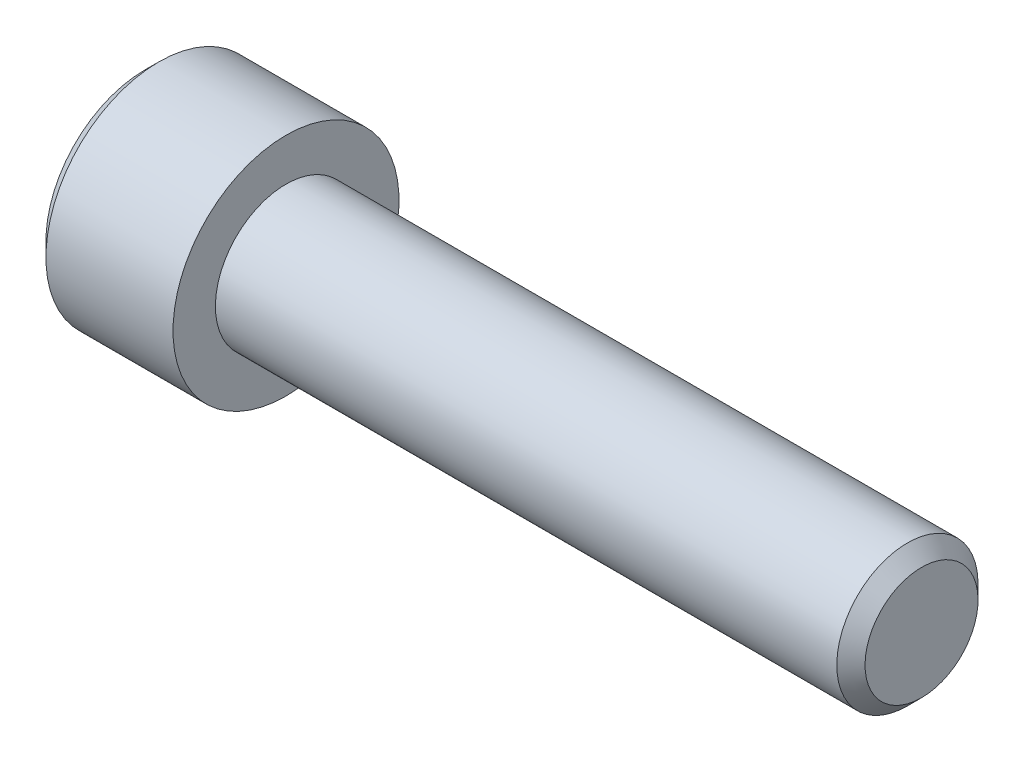
ISO-10303-21;
HEADER;
FILE_DESCRIPTION(('STEP AP214'),'2;1');
FILE_NAME('part.step','',(''),(''),'','','');
FILE_SCHEMA(('AUTOMOTIVE_DESIGN { 1 0 10303 214 1 1 1 1 }'));
ENDSEC;
DATA;
#1=APPLICATION_CONTEXT('core data for automotive mechanical design processes');
#2=APPLICATION_PROTOCOL_DEFINITION('international standard','automotive_design',2000,#1);
#3=PRODUCT_CONTEXT('',#1,'mechanical');
#4=PRODUCT('Part','Part','',(#3));
#5=PRODUCT_RELATED_PRODUCT_CATEGORY('part','',(#4));
#6=PRODUCT_DEFINITION_FORMATION('','',#4);
#7=PRODUCT_DEFINITION_CONTEXT('part definition',#1,'design');
#8=PRODUCT_DEFINITION('design','',#6,#7);
#9=PRODUCT_DEFINITION_SHAPE('','',#8);
#10=(LENGTH_UNIT() NAMED_UNIT(*) SI_UNIT(.MILLI.,.METRE.));
#11=(NAMED_UNIT(*) PLANE_ANGLE_UNIT() SI_UNIT($,.RADIAN.));
#12=(NAMED_UNIT(*) SI_UNIT($,.STERADIAN.) SOLID_ANGLE_UNIT());
#13=UNCERTAINTY_MEASURE_WITH_UNIT(LENGTH_MEASURE(1.E-05),#10,'distance_accuracy_value','');
#14=(GEOMETRIC_REPRESENTATION_CONTEXT(3) GLOBAL_UNCERTAINTY_ASSIGNED_CONTEXT((#13)) GLOBAL_UNIT_ASSIGNED_CONTEXT((#10,
#11,#12)) REPRESENTATION_CONTEXT('',''));
#15=CARTESIAN_POINT('',(0.,0.,0.));
#16=DIRECTION('',(0.,0.,1.));
#17=DIRECTION('',(1.,0.,0.));
#18=AXIS2_PLACEMENT_3D('',#15,#16,#17);
#19=CARTESIAN_POINT('',(-10.,0.,0.));
#20=DIRECTION('',(1.,0.,0.));
#21=DIRECTION('',(0.,1.,0.));
#22=AXIS2_PLACEMENT_3D('',#19,#20,#21);
#23=PLANE('',#22);
#24=CARTESIAN_POINT('',(-10.,0.,0.));
#25=DIRECTION('',(1.,0.,0.));
#26=DIRECTION('',(0.,1.,0.));
#27=AXIS2_PLACEMENT_3D('',#24,#25,#26);
#28=CIRCLE('',#27,7.);
#29=CARTESIAN_POINT('',(-10.,7.,0.));
#30=VERTEX_POINT('',#29);
#31=EDGE_CURVE('E42',#30,#30,#28,.F.);
#32=ORIENTED_EDGE('',*,*,#31,.T.);
#33=EDGE_LOOP('',(#32));
#34=FACE_BOUND('',#33,.T.);
#35=DIRECTION('',(0.,0.5,0.866025403784439));
#36=VECTOR('',#35,1.);
#37=CARTESIAN_POINT('',(-10.,2.30940107675851,-4.));
#38=LINE('',#37,#36);
#39=CARTESIAN_POINT('',(-10.,2.30940107675851,-4.));
#40=VERTEX_POINT('',#39);
#41=CARTESIAN_POINT('',(-10.,4.61880215351701,0.));
#42=VERTEX_POINT('',#41);
#43=EDGE_CURVE('E49',#40,#42,#38,.T.);
#44=ORIENTED_EDGE('',*,*,#43,.T.);
#45=DIRECTION('',(0.,-0.5,0.866025403784438));
#46=VECTOR('',#45,1.);
#47=CARTESIAN_POINT('',(-10.,4.61880215351701,0.));
#48=LINE('',#47,#46);
#49=CARTESIAN_POINT('',(-10.,2.3094010767585,4.));
#50=VERTEX_POINT('',#49);
#51=EDGE_CURVE('E107',#42,#50,#48,.T.);
#52=ORIENTED_EDGE('',*,*,#51,.T.);
#53=DIRECTION('',(0.,-1.,0.));
#54=VECTOR('',#53,1.);
#55=CARTESIAN_POINT('',(-10.,2.3094010767585,4.));
#56=LINE('',#55,#54);
#57=CARTESIAN_POINT('',(-10.,-2.3094010767585,4.));
#58=VERTEX_POINT('',#57);
#59=EDGE_CURVE('E291',#50,#58,#56,.T.);
#60=ORIENTED_EDGE('',*,*,#59,.T.);
#61=DIRECTION('',(0.,-0.5,-0.866025403784439));
#62=VECTOR('',#61,1.);
#63=CARTESIAN_POINT('',(-10.,-2.3094010767585,4.));
#64=LINE('',#63,#62);
#65=CARTESIAN_POINT('',(-10.,-4.61880215351701,0.));
#66=VERTEX_POINT('',#65);
#67=EDGE_CURVE('E288',#58,#66,#64,.T.);
#68=ORIENTED_EDGE('',*,*,#67,.T.);
#69=DIRECTION('',(0.,0.5,-0.866025403784439));
#70=VECTOR('',#69,1.);
#71=CARTESIAN_POINT('',(-10.,-4.61880215351701,0.));
#72=LINE('',#71,#70);
#73=CARTESIAN_POINT('',(-10.,-2.3094010767585,-4.));
#74=VERTEX_POINT('',#73);
#75=EDGE_CURVE('E282',#66,#74,#72,.T.);
#76=ORIENTED_EDGE('',*,*,#75,.T.);
#77=DIRECTION('',(0.,1.,0.));
#78=VECTOR('',#77,1.);
#79=CARTESIAN_POINT('',(-10.,-2.3094010767585,-4.));
#80=LINE('',#79,#78);
#81=EDGE_CURVE('E103',#74,#40,#80,.T.);
#82=ORIENTED_EDGE('',*,*,#81,.T.);
#83=EDGE_LOOP('',(#44,#52,#60,#68,#76,#82));
#84=FACE_BOUND('',#83,.T.);
#85=ADVANCED_FACE('F34',(#34,#84),#23,.F.);
#86=CARTESIAN_POINT('',(45.,0.,0.));
#87=DIRECTION('',(-1.,0.,0.));
#88=DIRECTION('',(0.,-1.,0.));
#89=AXIS2_PLACEMENT_3D('',#86,#87,#88);
#90=CYLINDRICAL_SURFACE('',#89,8.);
#91=CARTESIAN_POINT('',(-9.,0.,0.));
#92=DIRECTION('',(1.,0.,0.));
#93=DIRECTION('',(0.,1.,0.));
#94=AXIS2_PLACEMENT_3D('',#91,#92,#93);
#95=CIRCLE('',#94,8.);
#96=CARTESIAN_POINT('',(-9.,7.99999999999999,0.));
#97=VERTEX_POINT('',#96);
#98=EDGE_CURVE('E11',#97,#97,#95,.T.);
#99=ORIENTED_EDGE('',*,*,#98,.T.);
#100=EDGE_LOOP('',(#99));
#101=FACE_BOUND('',#100,.T.);
#102=CARTESIAN_POINT('',(0.,0.,0.));
#103=DIRECTION('',(-1.,0.,0.));
#104=DIRECTION('',(0.,-1.,0.));
#105=AXIS2_PLACEMENT_3D('',#102,#103,#104);
#106=CIRCLE('',#105,8.);
#107=CARTESIAN_POINT('',(0.,-8.,0.));
#108=VERTEX_POINT('',#107);
#109=EDGE_CURVE('E120',#108,#108,#106,.T.);
#110=ORIENTED_EDGE('',*,*,#109,.T.);
#111=EDGE_LOOP('',(#110));
#112=FACE_BOUND('',#111,.T.);
#113=ADVANCED_FACE('F143',(#101,#112),#90,.T.);
#114=CARTESIAN_POINT('',(0.,7.99999999999999,0.));
#115=DIRECTION('',(-1.,0.,0.));
#116=DIRECTION('',(0.,-1.,0.));
#117=AXIS2_PLACEMENT_3D('',#114,#115,#116);
#118=PLANE('',#117);
#119=ORIENTED_EDGE('',*,*,#109,.F.);
#120=EDGE_LOOP('',(#119));
#121=FACE_BOUND('',#120,.T.);
#122=CARTESIAN_POINT('',(0.,0.,0.));
#123=DIRECTION('',(-1.,0.,0.));
#124=DIRECTION('',(0.,-1.,0.));
#125=AXIS2_PLACEMENT_3D('',#122,#123,#124);
#126=CIRCLE('',#125,5.);
#127=CARTESIAN_POINT('',(0.,-5.,0.));
#128=VERTEX_POINT('',#127);
#129=EDGE_CURVE('E112',#128,#128,#126,.T.);
#130=ORIENTED_EDGE('',*,*,#129,.T.);
#131=EDGE_LOOP('',(#130));
#132=FACE_BOUND('',#131,.T.);
#133=ADVANCED_FACE('F148',(#121,#132),#118,.F.);
#134=CARTESIAN_POINT('',(45.,0.,0.));
#135=DIRECTION('',(-1.,0.,0.));
#136=DIRECTION('',(0.,-1.,0.));
#137=AXIS2_PLACEMENT_3D('',#134,#135,#136);
#138=CYLINDRICAL_SURFACE('',#137,5.);
#139=CARTESIAN_POINT('',(44.,0.,0.));
#140=DIRECTION('',(-1.,0.,0.));
#141=DIRECTION('',(0.,-1.,0.));
#142=AXIS2_PLACEMENT_3D('',#139,#140,#141);
#143=CIRCLE('',#142,5.);
#144=CARTESIAN_POINT('',(44.,-5.,0.));
#145=VERTEX_POINT('',#144);
#146=EDGE_CURVE('E123',#145,#145,#143,.T.);
#147=ORIENTED_EDGE('',*,*,#146,.T.);
#148=EDGE_LOOP('',(#147));
#149=FACE_BOUND('',#148,.T.);
#150=ORIENTED_EDGE('',*,*,#129,.F.);
#151=EDGE_LOOP('',(#150));
#152=FACE_BOUND('',#151,.T.);
#153=ADVANCED_FACE('F154',(#149,#152),#138,.T.);
#154=CARTESIAN_POINT('',(45.,4.99999999999999,0.));
#155=DIRECTION('',(-1.,0.,0.));
#156=DIRECTION('',(0.,-1.,0.));
#157=AXIS2_PLACEMENT_3D('',#154,#155,#156);
#158=PLANE('',#157);
#159=CARTESIAN_POINT('',(45.,0.,0.));
#160=DIRECTION('',(-1.,0.,0.));
#161=DIRECTION('',(0.,-1.,0.));
#162=AXIS2_PLACEMENT_3D('',#159,#160,#161);
#163=CIRCLE('',#162,3.99999999999998);
#164=CARTESIAN_POINT('',(45.,-3.99999999999999,0.));
#165=VERTEX_POINT('',#164);
#166=EDGE_CURVE('E126',#165,#165,#163,.F.);
#167=ORIENTED_EDGE('',*,*,#166,.T.);
#168=EDGE_LOOP('',(#167));
#169=FACE_BOUND('',#168,.T.);
#170=ADVANCED_FACE('F158',(#169),#158,.F.);
#171=CARTESIAN_POINT('',(-5.,2.30940107675851,-4.));
#172=DIRECTION('',(0.,-0.866025403784439,0.5));
#173=DIRECTION('',(0.,-0.5,-0.866025403784439));
#174=AXIS2_PLACEMENT_3D('',#171,#172,#173);
#175=PLANE('',#174);
#176=ORIENTED_EDGE('',*,*,#43,.F.);
#177=DIRECTION('',(-1.,0.,0.));
#178=VECTOR('',#177,1.);
#179=CARTESIAN_POINT('',(-5.,2.30940107675851,-4.));
#180=LINE('',#179,#178);
#181=CARTESIAN_POINT('',(-5.,2.30940107675851,-4.));
#182=VERTEX_POINT('',#181);
#183=EDGE_CURVE('E102',#182,#40,#180,.T.);
#184=ORIENTED_EDGE('',*,*,#183,.F.);
#185=DIRECTION('',(0.,0.5,0.866025403784439));
#186=VECTOR('',#185,1.);
#187=CARTESIAN_POINT('',(-5.,2.30940107675851,-4.));
#188=LINE('',#187,#186);
#189=CARTESIAN_POINT('',(-5.,4.61880215351701,0.));
#190=VERTEX_POINT('',#189);
#191=EDGE_CURVE('E93',#182,#190,#188,.T.);
#192=ORIENTED_EDGE('',*,*,#191,.T.);
#193=DIRECTION('',(-1.,0.,0.));
#194=VECTOR('',#193,1.);
#195=CARTESIAN_POINT('',(-5.,4.61880215351701,0.));
#196=LINE('',#195,#194);
#197=EDGE_CURVE('E101',#190,#42,#196,.T.);
#198=ORIENTED_EDGE('',*,*,#197,.T.);
#199=EDGE_LOOP('',(#176,#184,#192,#198));
#200=FACE_BOUND('',#199,.T.);
#201=ADVANCED_FACE('F100',(#200),#175,.T.);
#202=CARTESIAN_POINT('',(-5.,4.61880215351701,0.));
#203=DIRECTION('',(0.,-0.866025403784438,-0.5));
#204=DIRECTION('',(0.,0.5,-0.866025403784439));
#205=AXIS2_PLACEMENT_3D('',#202,#203,#204);
#206=PLANE('',#205);
#207=ORIENTED_EDGE('',*,*,#51,.F.);
#208=ORIENTED_EDGE('',*,*,#197,.F.);
#209=DIRECTION('',(0.,-0.5,0.866025403784438));
#210=VECTOR('',#209,1.);
#211=CARTESIAN_POINT('',(-5.,4.61880215351701,0.));
#212=LINE('',#211,#210);
#213=CARTESIAN_POINT('',(-5.,2.3094010767585,4.));
#214=VERTEX_POINT('',#213);
#215=EDGE_CURVE('E89',#190,#214,#212,.T.);
#216=ORIENTED_EDGE('',*,*,#215,.T.);
#217=DIRECTION('',(-1.,0.,0.));
#218=VECTOR('',#217,1.);
#219=CARTESIAN_POINT('',(-5.,2.3094010767585,4.));
#220=LINE('',#219,#218);
#221=EDGE_CURVE('E109',#214,#50,#220,.T.);
#222=ORIENTED_EDGE('',*,*,#221,.T.);
#223=EDGE_LOOP('',(#207,#208,#216,#222));
#224=FACE_BOUND('',#223,.T.);
#225=ADVANCED_FACE('F105',(#224),#206,.T.);
#226=CARTESIAN_POINT('',(-5.,2.3094010767585,4.));
#227=DIRECTION('',(0.,0.,-1.));
#228=DIRECTION('',(0.,1.,0.));
#229=AXIS2_PLACEMENT_3D('',#226,#227,#228);
#230=PLANE('',#229);
#231=ORIENTED_EDGE('',*,*,#59,.F.);
#232=ORIENTED_EDGE('',*,*,#221,.F.);
#233=DIRECTION('',(0.,-1.,0.));
#234=VECTOR('',#233,1.);
#235=CARTESIAN_POINT('',(-5.,2.3094010767585,4.));
#236=LINE('',#235,#234);
#237=CARTESIAN_POINT('',(-5.,-2.3094010767585,4.));
#238=VERTEX_POINT('',#237);
#239=EDGE_CURVE('E95',#214,#238,#236,.T.);
#240=ORIENTED_EDGE('',*,*,#239,.T.);
#241=DIRECTION('',(-1.,0.,0.));
#242=VECTOR('',#241,1.);
#243=CARTESIAN_POINT('',(-5.,-2.3094010767585,4.));
#244=LINE('',#243,#242);
#245=EDGE_CURVE('E114',#238,#58,#244,.T.);
#246=ORIENTED_EDGE('',*,*,#245,.T.);
#247=EDGE_LOOP('',(#231,#232,#240,#246));
#248=FACE_BOUND('',#247,.T.);
#249=ADVANCED_FACE('F170',(#248),#230,.T.);
#250=CARTESIAN_POINT('',(-5.,-2.3094010767585,4.));
#251=DIRECTION('',(0.,0.866025403784439,-0.5));
#252=DIRECTION('',(0.,0.5,0.866025403784439));
#253=AXIS2_PLACEMENT_3D('',#250,#251,#252);
#254=PLANE('',#253);
#255=ORIENTED_EDGE('',*,*,#67,.F.);
#256=ORIENTED_EDGE('',*,*,#245,.F.);
#257=DIRECTION('',(0.,-0.5,-0.866025403784439));
#258=VECTOR('',#257,1.);
#259=CARTESIAN_POINT('',(-5.,-2.3094010767585,4.));
#260=LINE('',#259,#258);
#261=CARTESIAN_POINT('',(-5.,-4.618802153517,0.));
#262=VERTEX_POINT('',#261);
#263=EDGE_CURVE('E307',#238,#262,#260,.T.);
#264=ORIENTED_EDGE('',*,*,#263,.T.);
#265=DIRECTION('',(-1.,0.,0.));
#266=VECTOR('',#265,1.);
#267=CARTESIAN_POINT('',(-5.,-4.618802153517,0.));
#268=LINE('',#267,#266);
#269=EDGE_CURVE('E298',#262,#66,#268,.T.);
#270=ORIENTED_EDGE('',*,*,#269,.T.);
#271=EDGE_LOOP('',(#255,#256,#264,#270));
#272=FACE_BOUND('',#271,.T.);
#273=ADVANCED_FACE('F173',(#272),#254,.T.);
#274=CARTESIAN_POINT('',(-5.,-4.618802153517,0.));
#275=DIRECTION('',(0.,0.866025403784439,0.5));
#276=DIRECTION('',(0.,-0.5,0.866025403784439));
#277=AXIS2_PLACEMENT_3D('',#274,#275,#276);
#278=PLANE('',#277);
#279=ORIENTED_EDGE('',*,*,#75,.F.);
#280=ORIENTED_EDGE('',*,*,#269,.F.);
#281=DIRECTION('',(0.,0.5,-0.866025403784439));
#282=VECTOR('',#281,1.);
#283=CARTESIAN_POINT('',(-5.,-4.618802153517,0.));
#284=LINE('',#283,#282);
#285=CARTESIAN_POINT('',(-5.,-2.3094010767585,-4.));
#286=VERTEX_POINT('',#285);
#287=EDGE_CURVE('E305',#262,#286,#284,.T.);
#288=ORIENTED_EDGE('',*,*,#287,.T.);
#289=DIRECTION('',(-1.,0.,0.));
#290=VECTOR('',#289,1.);
#291=CARTESIAN_POINT('',(-5.,-2.3094010767585,-4.));
#292=LINE('',#291,#290);
#293=EDGE_CURVE('E281',#286,#74,#292,.T.);
#294=ORIENTED_EDGE('',*,*,#293,.T.);
#295=EDGE_LOOP('',(#279,#280,#288,#294));
#296=FACE_BOUND('',#295,.T.);
#297=ADVANCED_FACE('F177',(#296),#278,.T.);
#298=CARTESIAN_POINT('',(-5.,-2.3094010767585,-4.));
#299=DIRECTION('',(0.,0.,1.));
#300=DIRECTION('',(0.,-1.,0.));
#301=AXIS2_PLACEMENT_3D('',#298,#299,#300);
#302=PLANE('',#301);
#303=ORIENTED_EDGE('',*,*,#81,.F.);
#304=ORIENTED_EDGE('',*,*,#293,.F.);
#305=DIRECTION('',(0.,1.,0.));
#306=VECTOR('',#305,1.);
#307=CARTESIAN_POINT('',(-5.,-2.3094010767585,-4.));
#308=LINE('',#307,#306);
#309=EDGE_CURVE('E296',#286,#182,#308,.T.);
#310=ORIENTED_EDGE('',*,*,#309,.T.);
#311=ORIENTED_EDGE('',*,*,#183,.T.);
#312=EDGE_LOOP('',(#303,#304,#310,#311));
#313=FACE_BOUND('',#312,.T.);
#314=ADVANCED_FACE('F181',(#313),#302,.T.);
#315=CARTESIAN_POINT('',(-5.,4.61880215351701,0.));
#316=DIRECTION('',(1.,0.,0.));
#317=DIRECTION('',(0.,0.,-1.));
#318=AXIS2_PLACEMENT_3D('',#315,#316,#317);
#319=PLANE('',#318);
#320=CARTESIAN_POINT('',(-5.,0.,0.));
#321=DIRECTION('',(1.,0.,0.));
#322=DIRECTION('',(0.,0.,-1.));
#323=AXIS2_PLACEMENT_3D('',#320,#321,#322);
#324=CIRCLE('',#323,3.995);
#325=CARTESIAN_POINT('',(-5.,0.,-3.995));
#326=VERTEX_POINT('',#325);
#327=EDGE_CURVE('E108',#326,#326,#324,.T.);
#328=ORIENTED_EDGE('',*,*,#327,.T.);
#329=EDGE_LOOP('',(#328));
#330=FACE_BOUND('',#329,.T.);
#331=ORIENTED_EDGE('',*,*,#191,.F.);
#332=ORIENTED_EDGE('',*,*,#309,.F.);
#333=ORIENTED_EDGE('',*,*,#287,.F.);
#334=ORIENTED_EDGE('',*,*,#263,.F.);
#335=ORIENTED_EDGE('',*,*,#239,.F.);
#336=ORIENTED_EDGE('',*,*,#215,.F.);
#337=EDGE_LOOP('',(#331,#332,#333,#334,#335,#336));
#338=FACE_BOUND('',#337,.T.);
#339=ADVANCED_FACE('F91',(#330,#338),#319,.F.);
#340=CARTESIAN_POINT('',(-3.92954297623768,0.,0.));
#341=DIRECTION('',(-1.,0.,0.));
#342=DIRECTION('',(0.,-1.,0.));
#343=AXIS2_PLACEMENT_3D('',#340,#341,#342);
#344=CONICAL_SURFACE('',#343,0.,1.30899693899575);
#345=ORIENTED_EDGE('',*,*,#327,.F.);
#346=EDGE_LOOP('',(#345));
#347=FACE_BOUND('',#346,.T.);
#348=CARTESIAN_POINT('',(-3.92954297623768,0.,0.));
#349=VERTEX_POINT('',#348);
#350=VERTEX_LOOP('',#349);
#351=FACE_BOUND('',#350,.T.);
#352=ADVANCED_FACE('F139',(#347,#351),#344,.F.);
#353=CARTESIAN_POINT('',(44.,0.,0.));
#354=DIRECTION('',(-1.,0.,0.));
#355=DIRECTION('',(0.,-1.,0.));
#356=AXIS2_PLACEMENT_3D('',#353,#354,#355);
#357=CONICAL_SURFACE('',#356,5.,0.785398163397453);
#358=ORIENTED_EDGE('',*,*,#166,.F.);
#359=EDGE_LOOP('',(#358));
#360=FACE_BOUND('',#359,.T.);
#361=ORIENTED_EDGE('',*,*,#146,.F.);
#362=EDGE_LOOP('',(#361));
#363=FACE_BOUND('',#362,.T.);
#364=ADVANCED_FACE('F134',(#360,#363),#357,.T.);
#365=CARTESIAN_POINT('',(-9.99999999999999,0.,0.));
#366=DIRECTION('',(1.,0.,0.));
#367=DIRECTION('',(0.,1.,0.));
#368=AXIS2_PLACEMENT_3D('',#365,#366,#367);
#369=CONICAL_SURFACE('',#368,7.00000000000001,0.785398163397447);
#370=ORIENTED_EDGE('',*,*,#98,.F.);
#371=EDGE_LOOP('',(#370));
#372=FACE_BOUND('',#371,.T.);
#373=ORIENTED_EDGE('',*,*,#31,.F.);
#374=EDGE_LOOP('',(#373));
#375=FACE_BOUND('',#374,.T.);
#376=ADVANCED_FACE('F36',(#372,#375),#369,.T.);
#377=CLOSED_SHELL('',(#85,#113,#133,#153,#170,#201,#225,#249,#273,#297,#314,#339,#352,#364,#376));
#378=MANIFOLD_SOLID_BREP('B2',#377);
#379=ADVANCED_BREP_SHAPE_REPRESENTATION('',(#18,#378),#14);
#380=SHAPE_DEFINITION_REPRESENTATION(#9,#379);
ENDSEC;
END-ISO-10303-21;
